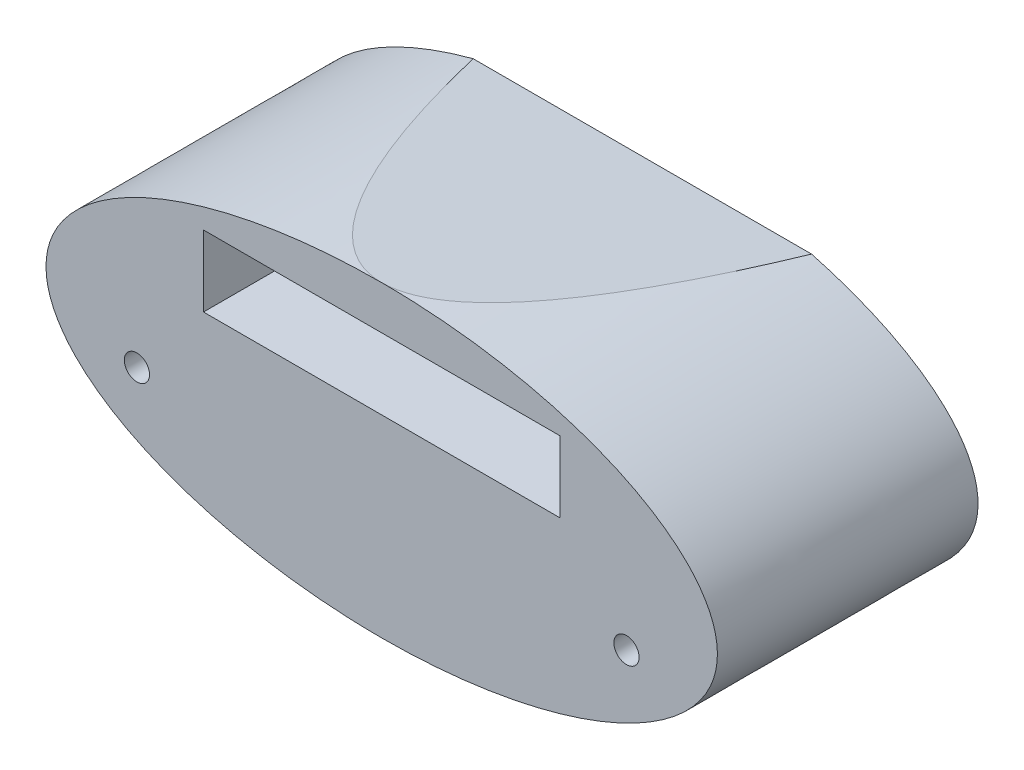
ISO-10303-21;
HEADER;
FILE_DESCRIPTION(('STEP AP214'),'2;1');
FILE_NAME('part.step','',(''),(''),'','','');
FILE_SCHEMA(('AUTOMOTIVE_DESIGN { 1 0 10303 214 1 1 1 1 }'));
ENDSEC;
DATA;
#1=APPLICATION_CONTEXT('core data for automotive mechanical design processes');
#2=APPLICATION_PROTOCOL_DEFINITION('international standard','automotive_design',2000,#1);
#3=PRODUCT_CONTEXT('',#1,'mechanical');
#4=PRODUCT('Part','Part','',(#3));
#5=PRODUCT_RELATED_PRODUCT_CATEGORY('part','',(#4));
#6=PRODUCT_DEFINITION_FORMATION('','',#4);
#7=PRODUCT_DEFINITION_CONTEXT('part definition',#1,'design');
#8=PRODUCT_DEFINITION('design','',#6,#7);
#9=PRODUCT_DEFINITION_SHAPE('','',#8);
#10=(LENGTH_UNIT() NAMED_UNIT(*) SI_UNIT(.MILLI.,.METRE.));
#11=(NAMED_UNIT(*) PLANE_ANGLE_UNIT() SI_UNIT($,.RADIAN.));
#12=(NAMED_UNIT(*) SI_UNIT($,.STERADIAN.) SOLID_ANGLE_UNIT());
#13=UNCERTAINTY_MEASURE_WITH_UNIT(LENGTH_MEASURE(1.E-05),#10,'distance_accuracy_value','');
#14=(GEOMETRIC_REPRESENTATION_CONTEXT(3) GLOBAL_UNCERTAINTY_ASSIGNED_CONTEXT((#13)) GLOBAL_UNIT_ASSIGNED_CONTEXT((#10,
#11,#12)) REPRESENTATION_CONTEXT('',''));
#15=CARTESIAN_POINT('',(0.,0.,0.));
#16=DIRECTION('',(0.,0.,1.));
#17=DIRECTION('',(1.,0.,0.));
#18=AXIS2_PLACEMENT_3D('',#15,#16,#17);
#19=CARTESIAN_POINT('',(0.,0.,-186.33));
#20=DIRECTION('',(0.,0.,1.));
#21=DIRECTION('',(1.,0.,0.));
#22=AXIS2_PLACEMENT_3D('',#19,#20,#21);
#23=ELLIPSE('',#22,240.,110.);
#24=DIRECTION('',(0.,0.,1.));
#25=VECTOR('',#24,1.);
#26=SURFACE_OF_LINEAR_EXTRUSION('',#23,#25);
#27=CARTESIAN_POINT('',(-120.987670979012,95.,-186.33));
#28=CARTESIAN_POINT('',(-120.23207515413,95.2021437868151,-183.818969880183));
#29=CARTESIAN_POINT('',(-119.467800227407,95.4040793580975,-181.310526213712));
#30=CARTESIAN_POINT('',(-117.920545508127,95.8076069391828,-176.297906601471));
#31=CARTESIAN_POINT('',(-117.137555910032,96.0091987068431,-173.793733663595));
#32=CARTESIAN_POINT('',(-115.552018117376,96.4119748130021,-168.790448872888));
#33=CARTESIAN_POINT('',(-114.749462273401,96.6131589577372,-166.291339426988));
#34=CARTESIAN_POINT('',(-113.12382840759,97.0150526338484,-161.299016182336));
#35=CARTESIAN_POINT('',(-112.300744933194,97.2157620232807,-158.805804146808));
#36=CARTESIAN_POINT('',(-110.632995855691,97.6166366296911,-153.826139785977));
#37=CARTESIAN_POINT('',(-109.788327012995,97.8168017599382,-151.339688538047));
#38=CARTESIAN_POINT('',(-108.07622777256,98.2165151360136,-146.374448980439));
#39=CARTESIAN_POINT('',(-107.208796306259,98.4160633523883,-143.895661036633));
#40=CARTESIAN_POINT('',(-105.438971289945,98.8169320469993,-138.916070112175));
#41=CARTESIAN_POINT('',(-104.5362784609,99.0182440236005,-136.415372738835));
#42=CARTESIAN_POINT('',(-102.704663686501,99.4200782390919,-131.423788114));
#43=CARTESIAN_POINT('',(-101.775744107907,99.6206005473944,-128.932900000266));
#44=CARTESIAN_POINT('',(-99.8899378324992,100.020767493863,-123.962026191238));
#45=CARTESIAN_POINT('',(-98.9330547865377,100.22041224272,-121.482039120934));
#46=CARTESIAN_POINT('',(-96.9893510806332,100.618728909412,-116.534149487287));
#47=CARTESIAN_POINT('',(-96.0025347485015,100.817400963102,-114.066245236347));
#48=CARTESIAN_POINT('',(-93.9967156847755,101.213668159061,-109.14381412815));
#49=CARTESIAN_POINT('',(-92.9777169812565,101.411263432501,-106.689285641469));
#50=CARTESIAN_POINT('',(-90.9049467457101,101.805263312899,-101.795019127169));
#51=CARTESIAN_POINT('',(-89.8511774049808,102.001667993969,-99.3552801789192));
#52=CARTESIAN_POINT('',(-87.9313307071577,102.352013766776,-95.0032849891087));
#53=CARTESIAN_POINT('',(-87.0723450262469,102.506205148965,-93.0879196395591));
#54=CARTESIAN_POINT('',(-85.329216083728,102.813675316,-89.2685252246522));
#55=CARTESIAN_POINT('',(-84.4450721798832,102.966954077427,-87.3644964501969));
#56=CARTESIAN_POINT('',(-82.6497985619518,103.27250611112,-83.568929087669));
#57=CARTESIAN_POINT('',(-81.7386667514168,103.424779304141,-81.6773914839549));
#58=CARTESIAN_POINT('',(-79.8873252339147,103.72821738086,-77.908083694963));
#59=CARTESIAN_POINT('',(-78.9471104799877,103.879382066495,-76.030315970004));
#60=CARTESIAN_POINT('',(-77.035197206218,104.180487966172,-72.2899784842124));
#61=CARTESIAN_POINT('',(-76.0634884499612,104.330428762186,-70.4274139161271));
#62=CARTESIAN_POINT('',(-74.0857958734082,104.628956755814,-66.7190991792787));
#63=CARTESIAN_POINT('',(-73.079793268394,104.777543153185,-64.8733589511376));
#64=CARTESIAN_POINT('',(-71.0304286281029,105.073187184612,-61.2008687927556));
#65=CARTESIAN_POINT('',(-69.9870407731897,105.220243667945,-59.3741331567875));
#66=CARTESIAN_POINT('',(-67.8601202383377,105.512511427296,-55.7435830501323));
#67=CARTESIAN_POINT('',(-66.7765808834383,105.657722391068,-53.939772458151));
#68=CARTESIAN_POINT('',(-64.5660996575565,105.945947419268,-50.3594411578551));
#69=CARTESIAN_POINT('',(-63.4391704792791,106.088962109296,-48.5829126783241));
#70=CARTESIAN_POINT('',(-61.1379844041021,106.37240868618,-45.0619393002773));
#71=CARTESIAN_POINT('',(-59.9637547320703,106.512841992889,-43.3174767643355));
#72=CARTESIAN_POINT('',(-57.5631876308679,106.790694159073,-39.865997155991));
#73=CARTESIAN_POINT('',(-56.336881586659,106.928114760573,-38.1589584441664));
#74=CARTESIAN_POINT('',(-53.8262152398939,107.199456021594,-34.7883572997635));
#75=CARTESIAN_POINT('',(-52.5418703778833,107.333377597201,-33.1247834875682));
#76=CARTESIAN_POINT('',(-50.2208898340151,107.565783405191,-30.2378385407148));
#77=CARTESIAN_POINT('',(-49.1977770791496,107.665137083503,-29.0036671487235));
#78=CARTESIAN_POINT('',(-47.1106234810752,107.861058998366,-26.5699251222983));
#79=CARTESIAN_POINT('',(-46.0465793323832,107.957627008849,-25.3703572960794));
#80=CARTESIAN_POINT('',(-43.8738885755468,108.147540626029,-23.0112503434659));
#81=CARTESIAN_POINT('',(-42.7652282164546,108.240885222526,-21.85172376578));
#82=CARTESIAN_POINT('',(-40.4987831357585,108.423856893245,-19.5788496721058));
#83=CARTESIAN_POINT('',(-39.3409489733754,108.513480037816,-18.4655509702522));
#84=CARTESIAN_POINT('',(-36.9848177056504,108.687382557387,-16.3053338721371));
#85=CARTESIAN_POINT('',(-35.7870158295828,108.771704977474,-15.2578807698241));
#86=CARTESIAN_POINT('',(-33.3370940247905,108.935112201706,-13.2280362304064));
#87=CARTESIAN_POINT('',(-32.0849794673733,109.014197521835,-12.2456383837652));
#88=CARTESIAN_POINT('',(-29.5250118999046,109.166049719702,-10.359330381863));
#89=CARTESIAN_POINT('',(-28.2172376270074,109.238825107888,-9.45531450981527));
#90=CARTESIAN_POINT('',(-25.5437204777565,109.376930867124,-7.73976476858755));
#91=CARTESIAN_POINT('',(-24.1780522568274,109.442270448674,-6.92811648657544));
#92=CARTESIAN_POINT('',(-22.0108568320171,109.536990917874,-5.75149881816307));
#93=CARTESIAN_POINT('',(-21.2297503869199,109.569399509518,-5.34891929276136));
#94=CARTESIAN_POINT('',(-19.6497640438578,109.631297711003,-4.58001983391748));
#95=CARTESIAN_POINT('',(-18.8508854728259,109.66078753788,-4.21369720445478));
#96=CARTESIAN_POINT('',(-17.2360388403484,109.716589788299,-3.52052164974473));
#97=CARTESIAN_POINT('',(-16.4200707622468,109.742902208745,-3.19366876296816));
#98=CARTESIAN_POINT('',(-14.7724710188983,109.792078496311,-2.58280091882563));
#99=CARTESIAN_POINT('',(-13.9408456973483,109.814943727655,-2.29876901506449));
#100=CARTESIAN_POINT('',(-12.2631457530866,109.856984362309,-1.77654025139376));
#101=CARTESIAN_POINT('',(-11.417070444502,109.876159589939,-1.53834557378153));
#102=CARTESIAN_POINT('',(-9.71256746552066,109.910582640112,-1.11074244452848));
#103=CARTESIAN_POINT('',(-8.85413988827817,109.925830492258,-0.921333625173694));
#104=CARTESIAN_POINT('',(-7.11996749360135,109.952308823092,-0.592419799555107));
#105=CARTESIAN_POINT('',(-6.24413707551156,109.963503347411,-0.453361418466375));
#106=CARTESIAN_POINT('',(-4.48545742220784,109.981525975067,-0.229484337721321));
#107=CARTESIAN_POINT('',(-3.60260784466205,109.9883538641,-0.144668300155245));
#108=CARTESIAN_POINT('',(-1.8333399845771,109.997537835578,-0.0305850064552187));
#109=CARTESIAN_POINT('',(-0.946921905263702,109.999894169166,-0.00131463062349606));
#110=CARTESIAN_POINT('',(0.826067188727071,110.00009885755,0.00122800848861349));
#111=CARTESIAN_POINT('',(1.71263820994497,109.997946859288,-0.0255041139283346));
#112=CARTESIAN_POINT('',(3.48235926415026,109.989167868137,-0.134556742007412));
#113=CARTESIAN_POINT('',(4.3655091053844,109.982540627964,-0.216880319435985));
#114=CARTESIAN_POINT('',(6.12492022544461,109.964912290048,-0.43585953302471));
#115=CARTESIAN_POINT('',(7.00118219696213,109.953911638016,-0.572509632564));
#116=CARTESIAN_POINT('',(8.4604780690361,109.931961043822,-0.845179913647779));
#117=CARTESIAN_POINT('',(9.04623450908781,109.922157114886,-0.966964318884287));
#118=CARTESIAN_POINT('',(10.2124557330301,109.900693930651,-1.23357999345282));
#119=CARTESIAN_POINT('',(10.7929202602948,109.889034585876,-1.37841237425326));
#120=CARTESIAN_POINT('',(12.5250339172112,109.851379345015,-1.84616577622188));
#121=CARTESIAN_POINT('',(13.6677748746613,109.822700581516,-2.20241337640952));
#122=CARTESIAN_POINT('',(15.924317138846,109.75881933087,-2.99594627193584));
#123=CARTESIAN_POINT('',(17.0381172878617,109.723616583201,-3.43323480348163));
#124=CARTESIAN_POINT('',(19.2341000766077,109.647341261599,-4.38072684842197));
#125=CARTESIAN_POINT('',(20.3162781595299,109.606267846665,-4.89094080872695));
#126=CARTESIAN_POINT('',(22.5894124438106,109.513078191617,-6.04854270373067));
#127=CARTESIAN_POINT('',(23.7756308538828,109.460219767456,-6.70515004866043));
#128=CARTESIAN_POINT('',(26.1052595183554,109.348659252842,-8.09095476119882));
#129=CARTESIAN_POINT('',(27.2486447243442,109.28995381432,-8.82019371851268));
#130=CARTESIAN_POINT('',(29.4928577772818,109.167503862285,-10.3412670226945));
#131=CARTESIAN_POINT('',(30.5936772914197,109.103758369475,-11.1331135343838));
#132=CARTESIAN_POINT('',(32.75740526825,108.971723443748,-12.7732513817674));
#133=CARTESIAN_POINT('',(33.8201849586656,108.903420475193,-13.6217108571519));
#134=CARTESIAN_POINT('',(35.9059198711634,108.763065562515,-15.3651995824443));
#135=CARTESIAN_POINT('',(36.9288866352853,108.691014719293,-16.2602151569386));
#136=CARTESIAN_POINT('',(38.937500694426,108.543654395584,-18.0907250980537));
#137=CARTESIAN_POINT('',(39.9231493424828,108.468345033452,-19.0262179944532));
#138=CARTESIAN_POINT('',(42.1056063765331,108.295386613042,-21.1747074927902));
#139=CARTESIAN_POINT('',(43.2924065728746,108.196924826053,-22.3977998107718));
#140=CARTESIAN_POINT('',(45.6158552748987,107.996202883309,-24.8911677835328));
#141=CARTESIAN_POINT('',(46.7524829968309,107.893941185171,-26.1614625978012));
#142=CARTESIAN_POINT('',(48.9801886672175,107.686130320858,-28.742889154297));
#143=CARTESIAN_POINT('',(50.0712276494129,107.580578471771,-30.0540542236587));
#144=CARTESIAN_POINT('',(52.2114117490476,107.366643987203,-32.7115483909593));
#145=CARTESIAN_POINT('',(53.2605230287372,107.258259177571,-34.0579044962151));
#146=CARTESIAN_POINT('',(55.319830533146,107.039070958872,-36.7806605488878));
#147=CARTESIAN_POINT('',(56.3300108785405,106.928266591179,-38.1570724043739));
#148=CARTESIAN_POINT('',(58.3139048476148,106.704618328628,-40.9352311217803));
#149=CARTESIAN_POINT('',(59.2876269633721,106.591774917911,-42.3369719697088));
#150=CARTESIAN_POINT('',(61.2109961044281,106.363170734478,-45.1766931363171));
#151=CARTESIAN_POINT('',(62.1603154704184,106.247392238629,-46.6148936117452));
#152=CARTESIAN_POINT('',(64.0267490083327,106.014303371552,-49.5103235185812));
#153=CARTESIAN_POINT('',(64.9438872935206,105.896994241735,-50.9675375291737));
#154=CARTESIAN_POINT('',(66.7486141924224,105.660996607001,-53.8991001478354));
#155=CARTESIAN_POINT('',(67.6362160418789,105.542308752978,-55.3734406705103));
#156=CARTESIAN_POINT('',(69.3841454776825,105.303688412904,-58.3375825349017));
#157=CARTESIAN_POINT('',(70.2444798565786,105.183756246862,-59.8273799014803));
#158=CARTESIAN_POINT('',(71.9398419266955,104.942767540186,-62.8209416158054));
#159=CARTESIAN_POINT('',(72.7748729157051,104.821711148783,-64.3247041098124));
#160=CARTESIAN_POINT('',(74.4213424432654,104.578582415729,-67.3448492318143));
#161=CARTESIAN_POINT('',(75.2327827441394,104.456510150848,-68.8612309061614));
#162=CARTESIAN_POINT('',(76.8573787047134,104.207804405422,-71.9506536758418));
#163=CARTESIAN_POINT('',(77.6698710826338,104.081143046728,-73.524041073548));
#164=CARTESIAN_POINT('',(79.2729816172689,103.826930670814,-76.6818672071474));
#165=CARTESIAN_POINT('',(80.0635994631944,103.699379640987,-78.2663060996582));
#166=CARTESIAN_POINT('',(81.6244136320765,103.443449492505,-81.4454704041057));
#167=CARTESIAN_POINT('',(82.3946065080392,103.315070238563,-83.0401974965649));
#168=CARTESIAN_POINT('',(83.9156385454017,103.057575069112,-86.2388024914954));
#169=CARTESIAN_POINT('',(84.6664775069777,102.928459146012,-87.8426804882385));
#170=CARTESIAN_POINT('',(86.892304009632,102.539985665953,-92.668298057532));
#171=CARTESIAN_POINT('',(88.3399140724042,102.279615506425,-95.9026161791879));
#172=CARTESIAN_POINT('',(91.170527448174,101.756465893611,-102.401180669567));
#173=CARTESIAN_POINT('',(92.5534956598439,101.493685221936,-105.665442173105));
#174=CARTESIAN_POINT('',(95.2610611296437,100.966053416486,-112.219684460415));
#175=CARTESIAN_POINT('',(96.5856307594329,100.701201371049,-115.509676568833));
#176=CARTESIAN_POINT('',(99.1815522774427,100.169733972716,-122.111564590923));
#177=CARTESIAN_POINT('',(100.452887998562,99.9031181122126,-125.423466810095));
#178=CARTESIAN_POINT('',(102.888078089103,99.3809613888809,-131.909697627322));
#179=CARTESIAN_POINT('',(104.05417667876,99.1254878106104,-135.083190416598));
#180=CARTESIAN_POINT('',(106.345130684406,98.6134144047015,-141.444166264798));
#181=CARTESIAN_POINT('',(107.469994698447,98.3568148244911,-144.631646250171));
#182=CARTESIAN_POINT('',(109.681150302081,97.8427142804228,-151.017803208589));
#183=CARTESIAN_POINT('',(110.767463733167,97.5852139207983,-154.216472675843));
#184=CARTESIAN_POINT('',(112.903826469307,97.0695268440081,-160.622337543732));
#185=CARTESIAN_POINT('',(113.953910202821,96.8113410444362,-163.829521546013));
#186=CARTESIAN_POINT('',(116.019843913726,96.2944911696392,-170.249830690742));
#187=CARTESIAN_POINT('',(117.03574004383,96.0358282809553,-173.462941093974));
#188=CARTESIAN_POINT('',(119.035025659736,95.5182229878807,-179.892634044546));
#189=CARTESIAN_POINT('',(120.018472207693,95.2592820032087,-183.109198956141));
#190=CARTESIAN_POINT('',(120.987670979012,95.,-186.33));
#191=B_SPLINE_CURVE_WITH_KNOTS('',3,(#27,#28,#29,#30,#31,#32,#33,#34,#35,#36,#37,#38,#39,#40,
#41,#42,#43,#44,#45,#46,#47,#48,#49,#50,#51,#52,#53,#54,#55,#56,#57,#58,#59,#60,#61,#62,#63,#64,
#65,#66,#67,#68,#69,#70,#71,#72,#73,#74,#75,#76,#77,#78,#79,#80,#81,#82,#83,#84,#85,#86,#87,#88,
#89,#90,#91,#92,#93,#94,#95,#96,#97,#98,#99,#100,#101,#102,#103,#104,#105,#106,#107,#108,#109,
#110,#111,#112,#113,#114,#115,#116,#117,#118,#119,#120,#121,#122,#123,#124,#125,#126,#127,#128,
#129,#130,#131,#132,#133,#134,#135,#136,#137,#138,#139,#140,#141,#142,#143,#144,#145,#146,#147,
#148,#149,#150,#151,#152,#153,#154,#155,#156,#157,#158,#159,#160,#161,#162,#163,#164,#165,#166,
#167,#168,#169,#170,#171,#172,#173,#174,#175,#176,#177,#178,#179,#180,#181,#182,#183,#184,#185,
#186,#187,#188,#189,#190),.UNSPECIFIED.,.F.,.F.,(4,2,2,2,2,2,2,2,2,2,2,2,2,2,2,2,2,2,2,2,2,2,2,
2,2,2,2,2,2,2,2,2,2,2,2,2,2,2,2,2,2,2,2,2,2,2,2,2,2,2,2,2,2,2,2,2,2,2,2,2,2,2,2,2,2,2,2,2,2,2,2,
2,2,2,2,2,2,2,2,2,2,4),(0.,7.89008719329245,15.7844031665799,23.6818565429294,31.5814304692685,
39.4821970295058,47.3833351471496,55.3819357597471,63.3798168538817,71.3766583858873,
79.3723491791921,87.3670431351028,95.3612342119934,101.675524114957,107.989975353375,
114.304918397975,120.620963534311,126.939082562001,133.260719826243,139.586810546231,
145.913957703303,152.239267853865,158.560987941605,164.878950724781,171.19524247121,
176.013006428875,180.831160273287,185.650810644476,190.475427196521,195.253721348322,
200.031544018496,204.802819022191,209.568118146523,212.205369290092,214.842424183179,
217.479481646558,220.115492739912,222.751629301977,225.387745994091,228.04670401279,
230.705792517059,233.364731670365,236.023879059709,238.683173395164,241.342196781346,
243.136831578868,244.93155294732,248.519863656718,252.108317688999,255.697286300374,
259.764840322276,263.834737011738,267.90542644601,271.988795882557,276.070972567775,
280.153001104027,285.272606750417,290.394313643776,295.520312242451,300.650367510845,
305.782493568316,310.913416686713,316.094409515171,321.271433517101,326.446105486389,
331.619478105982,336.792173554772,341.964481583323,347.29023621308,352.616066471343,
357.942789889265,363.269568282079,373.927828287487,384.591810176773,395.260784209248,
405.93297524277,416.104448306132,426.273788252585,436.437271483508,446.590814474545,
456.73005045433,466.850387076278),.UNSPECIFIED.);
#192=CARTESIAN_POINT('',(-120.987670979012,95.,-186.33));
#193=VERTEX_POINT('',#192);
#194=CARTESIAN_POINT('',(0.,110.,0.));
#195=VERTEX_POINT('',#194);
#196=EDGE_CURVE('E151',#193,#195,#191,.T.);
#197=ORIENTED_EDGE('',*,*,#196,.F.);
#198=CARTESIAN_POINT('',(-120.987670979012,-95.,-186.33));
#199=VERTEX_POINT('',#198);
#200=EDGE_CURVE('E11',#193,#199,#23,.T.);
#201=ORIENTED_EDGE('',*,*,#200,.T.);
#202=CARTESIAN_POINT('',(120.987670979012,-95.,-186.33));
#203=CARTESIAN_POINT('',(120.23207515413,-95.2021437868151,-183.818969880183));
#204=CARTESIAN_POINT('',(119.467800227407,-95.4040793580975,-181.310526213712));
#205=CARTESIAN_POINT('',(117.920545508127,-95.8076069391828,-176.297906601471));
#206=CARTESIAN_POINT('',(117.137555910032,-96.0091987068431,-173.793733663595));
#207=CARTESIAN_POINT('',(115.552018117376,-96.4119748130021,-168.790448872888));
#208=CARTESIAN_POINT('',(114.749462273401,-96.6131589577372,-166.291339426988));
#209=CARTESIAN_POINT('',(113.12382840759,-97.0150526338484,-161.299016182336));
#210=CARTESIAN_POINT('',(112.300744933194,-97.2157620232807,-158.805804146808));
#211=CARTESIAN_POINT('',(110.632995855691,-97.6166366296911,-153.826139785977));
#212=CARTESIAN_POINT('',(109.788327012995,-97.8168017599382,-151.339688538047));
#213=CARTESIAN_POINT('',(108.07622777256,-98.2165151360136,-146.374448980439));
#214=CARTESIAN_POINT('',(107.208796306259,-98.4160633523883,-143.895661036633));
#215=CARTESIAN_POINT('',(105.438971289945,-98.8169320469993,-138.916070112175));
#216=CARTESIAN_POINT('',(104.5362784609,-99.0182440236005,-136.415372738835));
#217=CARTESIAN_POINT('',(102.704663686501,-99.4200782390919,-131.423788114));
#218=CARTESIAN_POINT('',(101.775744107907,-99.6206005473944,-128.932900000266));
#219=CARTESIAN_POINT('',(99.8899378324992,-100.020767493863,-123.962026191238));
#220=CARTESIAN_POINT('',(98.9330547865377,-100.22041224272,-121.482039120934));
#221=CARTESIAN_POINT('',(96.9893510806332,-100.618728909412,-116.534149487287));
#222=CARTESIAN_POINT('',(96.0025347485015,-100.817400963102,-114.066245236347));
#223=CARTESIAN_POINT('',(93.9967156847754,-101.213668159061,-109.14381412815));
#224=CARTESIAN_POINT('',(92.9777169812565,-101.411263432501,-106.689285641469));
#225=CARTESIAN_POINT('',(90.90494674571,-101.805263312899,-101.795019127169));
#226=CARTESIAN_POINT('',(89.8511774049806,-102.001667993969,-99.3552801789191));
#227=CARTESIAN_POINT('',(87.9313307071576,-102.352013766776,-95.0032849891085));
#228=CARTESIAN_POINT('',(87.0723450262469,-102.506205148965,-93.0879196395589));
#229=CARTESIAN_POINT('',(85.3292160837279,-102.813675316,-89.268525224652));
#230=CARTESIAN_POINT('',(84.4450721798831,-102.966954077427,-87.3644964501968));
#231=CARTESIAN_POINT('',(82.6497985619518,-103.27250611112,-83.5689290876689));
#232=CARTESIAN_POINT('',(81.7386667514169,-103.424779304141,-81.6773914839547));
#233=CARTESIAN_POINT('',(79.8873252339147,-103.72821738086,-77.9080836949628));
#234=CARTESIAN_POINT('',(78.9471104799876,-103.879382066495,-76.0303159700039));
#235=CARTESIAN_POINT('',(77.035197206218,-104.180487966172,-72.2899784842124));
#236=CARTESIAN_POINT('',(76.0634884499612,-104.330428762186,-70.427413916127));
#237=CARTESIAN_POINT('',(74.0857958734082,-104.628956755814,-66.7190991792787));
#238=CARTESIAN_POINT('',(73.079793268394,-104.777543153185,-64.8733589511375));
#239=CARTESIAN_POINT('',(71.0304286281029,-105.073187184612,-61.2008687927555));
#240=CARTESIAN_POINT('',(69.9870407731897,-105.220243667945,-59.3741331567874));
#241=CARTESIAN_POINT('',(67.8601202383377,-105.512511427296,-55.7435830501323));
#242=CARTESIAN_POINT('',(66.7765808834384,-105.657722391068,-53.939772458151));
#243=CARTESIAN_POINT('',(64.5660996575566,-105.945947419268,-50.359441157855));
#244=CARTESIAN_POINT('',(63.439170479279,-106.088962109296,-48.5829126783241));
#245=CARTESIAN_POINT('',(61.1379844041021,-106.37240868618,-45.0619393002773));
#246=CARTESIAN_POINT('',(59.9637547320703,-106.512841992889,-43.3174767643355));
#247=CARTESIAN_POINT('',(57.563187630868,-106.790694159073,-39.865997155991));
#248=CARTESIAN_POINT('',(56.336881586659,-106.928114760573,-38.1589584441665));
#249=CARTESIAN_POINT('',(53.8262152398939,-107.199456021594,-34.7883572997636));
#250=CARTESIAN_POINT('',(52.5418703778833,-107.333377597201,-33.1247834875684));
#251=CARTESIAN_POINT('',(50.2208898340151,-107.565783405191,-30.2378385407149));
#252=CARTESIAN_POINT('',(49.1977770791497,-107.665137083503,-29.0036671487236));
#253=CARTESIAN_POINT('',(47.1106234810754,-107.861058998366,-26.5699251222983));
#254=CARTESIAN_POINT('',(46.0465793323833,-107.957627008849,-25.3703572960795));
#255=CARTESIAN_POINT('',(43.8738885755469,-108.147540626029,-23.011250343466));
#256=CARTESIAN_POINT('',(42.7652282164548,-108.240885222526,-21.8517237657801));
#257=CARTESIAN_POINT('',(40.4987831357587,-108.423856893245,-19.5788496721059));
#258=CARTESIAN_POINT('',(39.3409489733756,-108.513480037816,-18.4655509702523));
#259=CARTESIAN_POINT('',(36.9848177056505,-108.687382557387,-16.3053338721372));
#260=CARTESIAN_POINT('',(35.7870158295831,-108.771704977473,-15.2578807698242));
#261=CARTESIAN_POINT('',(33.3370940247907,-108.935112201706,-13.2280362304064));
#262=CARTESIAN_POINT('',(32.0849794673734,-109.014197521835,-12.2456383837653));
#263=CARTESIAN_POINT('',(29.5250118999046,-109.166049719702,-10.3593303818632));
#264=CARTESIAN_POINT('',(28.2172376270076,-109.238825107888,-9.45531450981542));
#265=CARTESIAN_POINT('',(25.5437204777568,-109.376930867124,-7.73976476858759));
#266=CARTESIAN_POINT('',(24.1780522568277,-109.442270448674,-6.92811648657543));
#267=CARTESIAN_POINT('',(22.0108568320173,-109.536990917874,-5.75149881816321));
#268=CARTESIAN_POINT('',(21.2297503869201,-109.569399509518,-5.34891929276159));
#269=CARTESIAN_POINT('',(19.649764043858,-109.631297711003,-4.58001983391768));
#270=CARTESIAN_POINT('',(18.8508854728262,-109.66078753788,-4.21369720445486));
#271=CARTESIAN_POINT('',(17.2360388403487,-109.716589788299,-3.52052164974475));
#272=CARTESIAN_POINT('',(16.420070762247,-109.742902208745,-3.19366876296825));
#273=CARTESIAN_POINT('',(14.7724710188985,-109.792078496311,-2.58280091882574));
#274=CARTESIAN_POINT('',(13.9408456973485,-109.814943727655,-2.29876901506456));
#275=CARTESIAN_POINT('',(12.2631457530869,-109.856984362309,-1.77654025139385));
#276=CARTESIAN_POINT('',(11.4170704445023,-109.876159589939,-1.53834557378168));
#277=CARTESIAN_POINT('',(9.71256746552095,-109.910582640112,-1.11074244452857));
#278=CARTESIAN_POINT('',(8.8541398882785,-109.925830492258,-0.921333625173674));
#279=CARTESIAN_POINT('',(7.1199674936017,-109.952308823092,-0.592419799555014));
#280=CARTESIAN_POINT('',(6.2441370755119,-109.963503347411,-0.453361418466327));
#281=CARTESIAN_POINT('',(4.48545742220816,-109.981525975067,-0.229484337721321));
#282=CARTESIAN_POINT('',(3.60260784466236,-109.9883538641,-0.144668300155247));
#283=CARTESIAN_POINT('',(1.8333399845774,-109.997537835578,-0.0305850064552765));
#284=CARTESIAN_POINT('',(0.946921905264,-109.999894169166,-0.00131463062360703));
#285=CARTESIAN_POINT('',(-0.826067188726794,-110.00009885755,0.00122800848858624));
#286=CARTESIAN_POINT('',(-1.71263820994471,-109.997946859288,-0.0255041139282251));
#287=CARTESIAN_POINT('',(-3.48235926415001,-109.989167868137,-0.134556742007261));
#288=CARTESIAN_POINT('',(-4.36550910538414,-109.982540627964,-0.216880319435929));
#289=CARTESIAN_POINT('',(-6.12492022544436,-109.964912290048,-0.435859533024683));
#290=CARTESIAN_POINT('',(-7.00118219696189,-109.953911638016,-0.572509632563907));
#291=CARTESIAN_POINT('',(-8.46047806903585,-109.931961043822,-0.845179913647701));
#292=CARTESIAN_POINT('',(-9.04623450908755,-109.922157114886,-0.966964318884248));
#293=CARTESIAN_POINT('',(-10.2124557330299,-109.900693930651,-1.23357999345269));
#294=CARTESIAN_POINT('',(-10.7929202602946,-109.889034585876,-1.37841237425299));
#295=CARTESIAN_POINT('',(-12.525033917211,-109.851379345015,-1.84616577622147));
#296=CARTESIAN_POINT('',(-13.667774874661,-109.822700581516,-2.20241337640935));
#297=CARTESIAN_POINT('',(-15.9243171388457,-109.75881933087,-2.99594627193579));
#298=CARTESIAN_POINT('',(-17.0381172878614,-109.723616583201,-3.43323480348146));
#299=CARTESIAN_POINT('',(-19.2341000766074,-109.647341261599,-4.38072684842177));
#300=CARTESIAN_POINT('',(-20.3162781595295,-109.606267846665,-4.89094080872684));
#301=CARTESIAN_POINT('',(-22.5894124438102,-109.513078191617,-6.04854270373061));
#302=CARTESIAN_POINT('',(-23.7756308538825,-109.460219767456,-6.70515004866031));
#303=CARTESIAN_POINT('',(-26.105259518355,-109.348659252842,-8.09095476119853));
#304=CARTESIAN_POINT('',(-27.248644724344,-109.28995381432,-8.82019371851229));
#305=CARTESIAN_POINT('',(-29.4928577772816,-109.167503862285,-10.341267022694));
#306=CARTESIAN_POINT('',(-30.5936772914195,-109.103758369475,-11.1331135343834));
#307=CARTESIAN_POINT('',(-32.7574052682496,-108.971723443748,-12.773251381767));
#308=CARTESIAN_POINT('',(-33.8201849586652,-108.903420475193,-13.6217108571515));
#309=CARTESIAN_POINT('',(-35.905919871163,-108.763065562515,-15.3651995824439));
#310=CARTESIAN_POINT('',(-36.9288866352849,-108.691014719293,-16.2602151569383));
#311=CARTESIAN_POINT('',(-38.9375006944256,-108.543654395584,-18.0907250980533));
#312=CARTESIAN_POINT('',(-39.9231493424825,-108.468345033453,-19.0262179944526));
#313=CARTESIAN_POINT('',(-42.1056063765328,-108.295386613042,-21.1747074927896));
#314=CARTESIAN_POINT('',(-43.2924065728741,-108.196924826053,-22.3977998107713));
#315=CARTESIAN_POINT('',(-45.6158552748981,-107.996202883309,-24.8911677835324));
#316=CARTESIAN_POINT('',(-46.7524829968304,-107.893941185171,-26.1614625978006));
#317=CARTESIAN_POINT('',(-48.9801886672171,-107.686130320858,-28.7428891542963));
#318=CARTESIAN_POINT('',(-50.0712276494124,-107.580578471771,-30.0540542236581));
#319=CARTESIAN_POINT('',(-52.2114117490471,-107.366643987203,-32.7115483909586));
#320=CARTESIAN_POINT('',(-53.2605230287367,-107.258259177571,-34.0579044962143));
#321=CARTESIAN_POINT('',(-55.3198305331455,-107.039070958872,-36.780660548887));
#322=CARTESIAN_POINT('',(-56.3300108785399,-106.928266591179,-38.1570724043731));
#323=CARTESIAN_POINT('',(-58.3139048476141,-106.704618328628,-40.9352311217795));
#324=CARTESIAN_POINT('',(-59.2876269633715,-106.591774917911,-42.3369719697079));
#325=CARTESIAN_POINT('',(-61.2109961044276,-106.363170734478,-45.1766931363162));
#326=CARTESIAN_POINT('',(-62.1603154704178,-106.24739223863,-46.6148936117443));
#327=CARTESIAN_POINT('',(-64.026749008332,-106.014303371552,-49.5103235185803));
#328=CARTESIAN_POINT('',(-64.9438872935201,-105.896994241735,-50.9675375291727));
#329=CARTESIAN_POINT('',(-66.7486141924219,-105.660996607001,-53.8991001478344));
#330=CARTESIAN_POINT('',(-67.6362160418784,-105.542308752978,-55.3734406705093));
#331=CARTESIAN_POINT('',(-69.384145477682,-105.303688412904,-58.3375825349007));
#332=CARTESIAN_POINT('',(-70.244479856578,-105.183756246862,-59.8273799014792));
#333=CARTESIAN_POINT('',(-71.9398419266949,-104.942767540186,-62.8209416158043));
#334=CARTESIAN_POINT('',(-72.7748729157046,-104.821711148784,-64.3247041098113));
#335=CARTESIAN_POINT('',(-74.4213424432648,-104.578582415729,-67.3448492318131));
#336=CARTESIAN_POINT('',(-75.2327827441388,-104.456510150848,-68.8612309061602));
#337=CARTESIAN_POINT('',(-76.8573787047127,-104.207804405423,-71.9506536758407));
#338=CARTESIAN_POINT('',(-77.6698710826332,-104.081143046728,-73.5240410735469));
#339=CARTESIAN_POINT('',(-79.2729816172684,-103.826930670814,-76.6818672071464));
#340=CARTESIAN_POINT('',(-80.063599463194,-103.699379640987,-78.2663060996571));
#341=CARTESIAN_POINT('',(-81.6244136320761,-103.443449492505,-81.4454704041047));
#342=CARTESIAN_POINT('',(-82.3946065080388,-103.315070238564,-83.0401974965639));
#343=CARTESIAN_POINT('',(-83.9156385454012,-103.057575069112,-86.2388024914945));
#344=CARTESIAN_POINT('',(-84.6664775069773,-102.928459146012,-87.8426804882376));
#345=CARTESIAN_POINT('',(-86.8923040096316,-102.539985665953,-92.6682980575312));
#346=CARTESIAN_POINT('',(-88.3399140724038,-102.279615506425,-95.9026161791872));
#347=CARTESIAN_POINT('',(-91.1705274481736,-101.756465893611,-102.401180669566));
#348=CARTESIAN_POINT('',(-92.5534956598436,-101.493685221936,-105.665442173105));
#349=CARTESIAN_POINT('',(-95.2610611296435,-100.966053416486,-112.219684460415));
#350=CARTESIAN_POINT('',(-96.5856307594328,-100.701201371049,-115.509676568833));
#351=CARTESIAN_POINT('',(-99.1815522774427,-100.169733972716,-122.111564590922));
#352=CARTESIAN_POINT('',(-100.452887998562,-99.9031181122127,-125.423466810095));
#353=CARTESIAN_POINT('',(-102.888078089103,-99.3809613888809,-131.909697627322));
#354=CARTESIAN_POINT('',(-104.05417667876,-99.1254878106104,-135.083190416598));
#355=CARTESIAN_POINT('',(-106.345130684405,-98.6134144047015,-141.444166264798));
#356=CARTESIAN_POINT('',(-107.469994698446,-98.3568148244911,-144.631646250171));
#357=CARTESIAN_POINT('',(-109.681150302081,-97.8427142804228,-151.017803208588));
#358=CARTESIAN_POINT('',(-110.767463733167,-97.5852139207983,-154.216472675843));
#359=CARTESIAN_POINT('',(-112.903826469307,-97.0695268440081,-160.622337543732));
#360=CARTESIAN_POINT('',(-113.953910202821,-96.8113410444363,-163.829521546013));
#361=CARTESIAN_POINT('',(-116.019843913726,-96.2944911696392,-170.249830690742));
#362=CARTESIAN_POINT('',(-117.03574004383,-96.0358282809553,-173.462941093974));
#363=CARTESIAN_POINT('',(-119.035025659736,-95.5182229878807,-179.892634044546));
#364=CARTESIAN_POINT('',(-120.018472207693,-95.2592820032087,-183.109198956141));
#365=CARTESIAN_POINT('',(-120.987670979012,-95.,-186.33));
#366=B_SPLINE_CURVE_WITH_KNOTS('',3,(#202,#203,#204,#205,#206,#207,#208,#209,#210,#211,#212,
#213,#214,#215,#216,#217,#218,#219,#220,#221,#222,#223,#224,#225,#226,#227,#228,#229,#230,#231,
#232,#233,#234,#235,#236,#237,#238,#239,#240,#241,#242,#243,#244,#245,#246,#247,#248,#249,#250,
#251,#252,#253,#254,#255,#256,#257,#258,#259,#260,#261,#262,#263,#264,#265,#266,#267,#268,#269,
#270,#271,#272,#273,#274,#275,#276,#277,#278,#279,#280,#281,#282,#283,#284,#285,#286,#287,#288,
#289,#290,#291,#292,#293,#294,#295,#296,#297,#298,#299,#300,#301,#302,#303,#304,#305,#306,#307,
#308,#309,#310,#311,#312,#313,#314,#315,#316,#317,#318,#319,#320,#321,#322,#323,#324,#325,#326,
#327,#328,#329,#330,#331,#332,#333,#334,#335,#336,#337,#338,#339,#340,#341,#342,#343,#344,#345,
#346,#347,#348,#349,#350,#351,#352,#353,#354,#355,#356,#357,#358,#359,#360,#361,#362,#363,#364,
#365),.UNSPECIFIED.,.F.,.F.,(4,2,2,2,2,2,2,2,2,2,2,2,2,2,2,2,2,2,2,2,2,2,2,2,2,2,2,2,2,2,2,2,2,
2,2,2,2,2,2,2,2,2,2,2,2,2,2,2,2,2,2,2,2,2,2,2,2,2,2,2,2,2,2,2,2,2,2,2,2,2,2,2,2,2,2,2,2,2,2,2,2,
4),(0.,7.89008719329243,15.7844031665799,23.6818565429295,31.5814304692685,39.4821970295059,
47.3833351471497,55.3819357597472,63.3798168538818,71.3766583858875,79.3723491791923,
87.367043135103,95.3612342119936,101.675524114957,107.989975353375,114.304918397976,
120.620963534311,126.939082562002,133.260719826244,139.586810546231,145.913957703303,
152.239267853865,158.560987941605,164.878950724781,171.19524247121,176.013006428875,
180.831160273286,185.650810644476,190.475427196521,195.253721348322,200.031544018496,
204.802819022191,209.568118146522,212.205369290092,214.842424183179,217.479481646557,
220.115492739912,222.751629301976,225.38774599409,228.046704012789,230.705792517058,
233.364731670365,236.023879059709,238.683173395164,241.342196781346,243.136831578867,
244.931552947319,248.519863656718,252.108317688998,255.697286300373,259.764840322276,
263.834737011737,267.90542644601,271.988795882556,276.070972567774,280.153001104027,
285.272606750416,290.394313643775,295.52031224245,300.650367510844,305.782493568315,
310.913416686712,316.094409515169,321.271433517099,326.446105486387,331.619478105981,
336.792173554771,341.964481583322,347.290236213078,352.616066471342,357.942789889264,
363.269568282078,373.927828287486,384.591810176772,395.260784209248,405.932975242769,
416.104448306132,426.273788252585,436.437271483508,446.590814474544,456.73005045433,
466.850387076278),.UNSPECIFIED.);
#367=CARTESIAN_POINT('',(0.,-110.,0.));
#368=VERTEX_POINT('',#367);
#369=EDGE_CURVE('E52',#368,#199,#366,.T.);
#370=ORIENTED_EDGE('',*,*,#369,.F.);
#371=CARTESIAN_POINT('',(0.,0.,0.));
#372=DIRECTION('',(0.,0.,1.));
#373=DIRECTION('',(1.,0.,0.));
#374=AXIS2_PLACEMENT_3D('',#371,#372,#373);
#375=ELLIPSE('',#374,240.,110.);
#376=EDGE_CURVE('E41',#195,#368,#375,.T.);
#377=ORIENTED_EDGE('',*,*,#376,.F.);
#378=EDGE_LOOP('',(#197,#201,#370,#377));
#379=FACE_BOUND('',#378,.T.);
#380=ADVANCED_FACE('F35',(#379),#26,.T.);
#381=CARTESIAN_POINT('',(120.987670979012,95.,-186.33));
#382=VERTEX_POINT('',#381);
#383=EDGE_CURVE('E60',#195,#382,#191,.T.);
#384=ORIENTED_EDGE('',*,*,#383,.F.);
#385=EDGE_CURVE('E109',#368,#195,#375,.T.);
#386=ORIENTED_EDGE('',*,*,#385,.F.);
#387=CARTESIAN_POINT('',(120.987670979012,-95.,-186.33));
#388=VERTEX_POINT('',#387);
#389=EDGE_CURVE('E94',#388,#368,#366,.T.);
#390=ORIENTED_EDGE('',*,*,#389,.F.);
#391=EDGE_CURVE('E45',#388,#382,#23,.T.);
#392=ORIENTED_EDGE('',*,*,#391,.T.);
#393=EDGE_LOOP('',(#384,#386,#390,#392));
#394=FACE_BOUND('',#393,.T.);
#395=ADVANCED_FACE('F37',(#394),#26,.T.);
#396=CARTESIAN_POINT('',(0.,0.,-186.33));
#397=DIRECTION('',(0.,0.,1.));
#398=DIRECTION('',(1.,0.,0.));
#399=AXIS2_PLACEMENT_3D('',#396,#397,#398);
#400=PLANE('',#399);
#401=CARTESIAN_POINT('',(175.,-30.,-186.33));
#402=DIRECTION('',(0.,0.,1.));
#403=DIRECTION('',(1.,0.,0.));
#404=AXIS2_PLACEMENT_3D('',#401,#402,#403);
#405=CIRCLE('',#404,9.00000000000001);
#406=CARTESIAN_POINT('',(184.,-30.,-186.33));
#407=VERTEX_POINT('',#406);
#408=EDGE_CURVE('E136',#407,#407,#405,.T.);
#409=ORIENTED_EDGE('',*,*,#408,.T.);
#410=EDGE_LOOP('',(#409));
#411=FACE_BOUND('',#410,.T.);
#412=CARTESIAN_POINT('',(-175.,-30.,-186.33));
#413=DIRECTION('',(0.,0.,1.));
#414=DIRECTION('',(-1.,0.,0.));
#415=AXIS2_PLACEMENT_3D('',#412,#413,#414);
#416=CIRCLE('',#415,9.00000000000001);
#417=CARTESIAN_POINT('',(-184.,-30.,-186.33));
#418=VERTEX_POINT('',#417);
#419=EDGE_CURVE('E150',#418,#418,#416,.T.);
#420=ORIENTED_EDGE('',*,*,#419,.T.);
#421=EDGE_LOOP('',(#420));
#422=FACE_BOUND('',#421,.T.);
#423=DIRECTION('',(-1.,0.,0.));
#424=VECTOR('',#423,1.);
#425=CARTESIAN_POINT('',(-127.4,78.9000000000001,-186.33));
#426=LINE('',#425,#424);
#427=CARTESIAN_POINT('',(127.4,78.9,-186.33));
#428=VERTEX_POINT('',#427);
#429=CARTESIAN_POINT('',(-127.4,78.9000000000001,-186.33));
#430=VERTEX_POINT('',#429);
#431=EDGE_CURVE('E119',#428,#430,#426,.T.);
#432=ORIENTED_EDGE('',*,*,#431,.T.);
#433=DIRECTION('',(0.,-1.,0.));
#434=VECTOR('',#433,1.);
#435=CARTESIAN_POINT('',(-127.4,78.9000000000001,-186.33));
#436=LINE('',#435,#434);
#437=CARTESIAN_POINT('',(-127.4,28.1,-186.33));
#438=VERTEX_POINT('',#437);
#439=EDGE_CURVE('E127',#430,#438,#436,.T.);
#440=ORIENTED_EDGE('',*,*,#439,.T.);
#441=DIRECTION('',(1.,0.,0.));
#442=VECTOR('',#441,1.);
#443=CARTESIAN_POINT('',(-127.4,28.1,-186.33));
#444=LINE('',#443,#442);
#445=CARTESIAN_POINT('',(127.4,28.1,-186.33));
#446=VERTEX_POINT('',#445);
#447=EDGE_CURVE('E142',#438,#446,#444,.T.);
#448=ORIENTED_EDGE('',*,*,#447,.T.);
#449=DIRECTION('',(0.,1.,0.));
#450=VECTOR('',#449,1.);
#451=CARTESIAN_POINT('',(127.4,78.9,-186.33));
#452=LINE('',#451,#450);
#453=EDGE_CURVE('E139',#446,#428,#452,.T.);
#454=ORIENTED_EDGE('',*,*,#453,.T.);
#455=EDGE_LOOP('',(#432,#440,#448,#454));
#456=FACE_BOUND('',#455,.T.);
#457=ORIENTED_EDGE('',*,*,#200,.F.);
#458=DIRECTION('',(1.,0.,0.));
#459=VECTOR('',#458,1.);
#460=CARTESIAN_POINT('',(-240.,95.,-186.33));
#461=LINE('',#460,#459);
#462=EDGE_CURVE('E107',#193,#382,#461,.T.);
#463=ORIENTED_EDGE('',*,*,#462,.T.);
#464=ORIENTED_EDGE('',*,*,#391,.F.);
#465=DIRECTION('',(1.,0.,0.));
#466=VECTOR('',#465,1.);
#467=CARTESIAN_POINT('',(-240.,-95.,-186.33));
#468=LINE('',#467,#466);
#469=EDGE_CURVE('E96',#199,#388,#468,.T.);
#470=ORIENTED_EDGE('',*,*,#469,.F.);
#471=EDGE_LOOP('',(#457,#463,#464,#470));
#472=FACE_BOUND('',#471,.T.);
#473=ADVANCED_FACE('F198',(#411,#422,#456,#472),#400,.F.);
#474=CARTESIAN_POINT('',(0.,0.,0.));
#475=DIRECTION('',(0.,0.,1.));
#476=DIRECTION('',(1.,0.,0.));
#477=AXIS2_PLACEMENT_3D('',#474,#475,#476);
#478=PLANE('',#477);
#479=CARTESIAN_POINT('',(175.,-30.,0.));
#480=DIRECTION('',(0.,0.,1.));
#481=DIRECTION('',(1.,0.,0.));
#482=AXIS2_PLACEMENT_3D('',#479,#480,#481);
#483=CIRCLE('',#482,9.00000000000001);
#484=CARTESIAN_POINT('',(184.,-30.,0.));
#485=VERTEX_POINT('',#484);
#486=EDGE_CURVE('E154',#485,#485,#483,.T.);
#487=ORIENTED_EDGE('',*,*,#486,.F.);
#488=EDGE_LOOP('',(#487));
#489=FACE_BOUND('',#488,.T.);
#490=CARTESIAN_POINT('',(-175.,-30.,0.));
#491=DIRECTION('',(0.,0.,1.));
#492=DIRECTION('',(-1.,0.,0.));
#493=AXIS2_PLACEMENT_3D('',#490,#491,#492);
#494=CIRCLE('',#493,9.00000000000001);
#495=CARTESIAN_POINT('',(-184.,-30.,0.));
#496=VERTEX_POINT('',#495);
#497=EDGE_CURVE('E147',#496,#496,#494,.T.);
#498=ORIENTED_EDGE('',*,*,#497,.F.);
#499=EDGE_LOOP('',(#498));
#500=FACE_BOUND('',#499,.T.);
#501=DIRECTION('',(0.,-1.,0.));
#502=VECTOR('',#501,1.);
#503=CARTESIAN_POINT('',(-127.4,78.9000000000001,0.));
#504=LINE('',#503,#502);
#505=CARTESIAN_POINT('',(-127.4,78.9000000000001,0.));
#506=VERTEX_POINT('',#505);
#507=CARTESIAN_POINT('',(-127.4,28.1,0.));
#508=VERTEX_POINT('',#507);
#509=EDGE_CURVE('E134',#506,#508,#504,.T.);
#510=ORIENTED_EDGE('',*,*,#509,.F.);
#511=DIRECTION('',(-1.,0.,0.));
#512=VECTOR('',#511,1.);
#513=CARTESIAN_POINT('',(-127.4,78.9000000000001,0.));
#514=LINE('',#513,#512);
#515=CARTESIAN_POINT('',(127.4,78.9,0.));
#516=VERTEX_POINT('',#515);
#517=EDGE_CURVE('E124',#516,#506,#514,.T.);
#518=ORIENTED_EDGE('',*,*,#517,.F.);
#519=DIRECTION('',(0.,1.,0.));
#520=VECTOR('',#519,1.);
#521=CARTESIAN_POINT('',(127.4,78.9,0.));
#522=LINE('',#521,#520);
#523=CARTESIAN_POINT('',(127.4,28.1,0.));
#524=VERTEX_POINT('',#523);
#525=EDGE_CURVE('E128',#524,#516,#522,.T.);
#526=ORIENTED_EDGE('',*,*,#525,.F.);
#527=DIRECTION('',(1.,0.,0.));
#528=VECTOR('',#527,1.);
#529=CARTESIAN_POINT('',(-127.4,28.1,0.));
#530=LINE('',#529,#528);
#531=EDGE_CURVE('E131',#508,#524,#530,.T.);
#532=ORIENTED_EDGE('',*,*,#531,.F.);
#533=EDGE_LOOP('',(#510,#518,#526,#532));
#534=FACE_BOUND('',#533,.T.);
#535=ORIENTED_EDGE('',*,*,#376,.T.);
#536=ORIENTED_EDGE('',*,*,#385,.T.);
#537=EDGE_LOOP('',(#535,#536));
#538=FACE_BOUND('',#537,.T.);
#539=ADVANCED_FACE('F112',(#489,#500,#534,#538),#478,.T.);
#540=CARTESIAN_POINT('',(-127.4,78.9000000000001,-186.33));
#541=DIRECTION('',(-1.,0.,0.));
#542=DIRECTION('',(0.,0.,1.));
#543=AXIS2_PLACEMENT_3D('',#540,#541,#542);
#544=PLANE('',#543);
#545=ORIENTED_EDGE('',*,*,#509,.T.);
#546=DIRECTION('',(0.,0.,1.));
#547=VECTOR('',#546,1.);
#548=CARTESIAN_POINT('',(-127.4,28.1,-186.33));
#549=LINE('',#548,#547);
#550=EDGE_CURVE('E115',#438,#508,#549,.T.);
#551=ORIENTED_EDGE('',*,*,#550,.F.);
#552=ORIENTED_EDGE('',*,*,#439,.F.);
#553=DIRECTION('',(0.,0.,1.));
#554=VECTOR('',#553,1.);
#555=CARTESIAN_POINT('',(-127.4,78.9000000000001,-186.33));
#556=LINE('',#555,#554);
#557=EDGE_CURVE('E111',#430,#506,#556,.T.);
#558=ORIENTED_EDGE('',*,*,#557,.T.);
#559=EDGE_LOOP('',(#545,#551,#552,#558));
#560=FACE_BOUND('',#559,.T.);
#561=ADVANCED_FACE('F187',(#560),#544,.F.);
#562=CARTESIAN_POINT('',(-127.4,78.9000000000001,-186.33));
#563=DIRECTION('',(0.,1.,0.));
#564=DIRECTION('',(-1.,0.,0.));
#565=AXIS2_PLACEMENT_3D('',#562,#563,#564);
#566=PLANE('',#565);
#567=ORIENTED_EDGE('',*,*,#517,.T.);
#568=ORIENTED_EDGE('',*,*,#557,.F.);
#569=ORIENTED_EDGE('',*,*,#431,.F.);
#570=DIRECTION('',(0.,0.,1.));
#571=VECTOR('',#570,1.);
#572=CARTESIAN_POINT('',(127.4,78.9,-186.33));
#573=LINE('',#572,#571);
#574=EDGE_CURVE('E121',#428,#516,#573,.T.);
#575=ORIENTED_EDGE('',*,*,#574,.T.);
#576=EDGE_LOOP('',(#567,#568,#569,#575));
#577=FACE_BOUND('',#576,.T.);
#578=ADVANCED_FACE('F183',(#577),#566,.F.);
#579=CARTESIAN_POINT('',(127.4,78.9,-186.33));
#580=DIRECTION('',(1.,0.,0.));
#581=DIRECTION('',(0.,0.,-1.));
#582=AXIS2_PLACEMENT_3D('',#579,#580,#581);
#583=PLANE('',#582);
#584=ORIENTED_EDGE('',*,*,#525,.T.);
#585=ORIENTED_EDGE('',*,*,#574,.F.);
#586=ORIENTED_EDGE('',*,*,#453,.F.);
#587=DIRECTION('',(0.,0.,1.));
#588=VECTOR('',#587,1.);
#589=CARTESIAN_POINT('',(127.4,28.1,-186.33));
#590=LINE('',#589,#588);
#591=EDGE_CURVE('E118',#446,#524,#590,.T.);
#592=ORIENTED_EDGE('',*,*,#591,.T.);
#593=EDGE_LOOP('',(#584,#585,#586,#592));
#594=FACE_BOUND('',#593,.T.);
#595=ADVANCED_FACE('F186',(#594),#583,.F.);
#596=CARTESIAN_POINT('',(-127.4,28.1,-186.33));
#597=DIRECTION('',(0.,-1.,0.));
#598=DIRECTION('',(1.,0.,0.));
#599=AXIS2_PLACEMENT_3D('',#596,#597,#598);
#600=PLANE('',#599);
#601=ORIENTED_EDGE('',*,*,#531,.T.);
#602=ORIENTED_EDGE('',*,*,#591,.F.);
#603=ORIENTED_EDGE('',*,*,#447,.F.);
#604=ORIENTED_EDGE('',*,*,#550,.T.);
#605=EDGE_LOOP('',(#601,#602,#603,#604));
#606=FACE_BOUND('',#605,.T.);
#607=ADVANCED_FACE('F181',(#606),#600,.F.);
#608=CARTESIAN_POINT('',(-175.,-30.,-186.33));
#609=DIRECTION('',(0.,0.,1.));
#610=DIRECTION('',(1.,0.,0.));
#611=AXIS2_PLACEMENT_3D('',#608,#609,#610);
#612=CYLINDRICAL_SURFACE('',#611,9.00000000000001);
#613=ORIENTED_EDGE('',*,*,#419,.F.);
#614=EDGE_LOOP('',(#613));
#615=FACE_BOUND('',#614,.T.);
#616=ORIENTED_EDGE('',*,*,#497,.T.);
#617=EDGE_LOOP('',(#616));
#618=FACE_BOUND('',#617,.T.);
#619=ADVANCED_FACE('F177',(#615,#618),#612,.F.);
#620=CARTESIAN_POINT('',(175.,-30.,-186.33));
#621=DIRECTION('',(0.,0.,1.));
#622=DIRECTION('',(1.,0.,0.));
#623=AXIS2_PLACEMENT_3D('',#620,#621,#622);
#624=CYLINDRICAL_SURFACE('',#623,9.00000000000001);
#625=ORIENTED_EDGE('',*,*,#408,.F.);
#626=EDGE_LOOP('',(#625));
#627=FACE_BOUND('',#626,.T.);
#628=ORIENTED_EDGE('',*,*,#486,.T.);
#629=EDGE_LOOP('',(#628));
#630=FACE_BOUND('',#629,.T.);
#631=ADVANCED_FACE('F174',(#627,#630),#624,.F.);
#632=CARTESIAN_POINT('',(-240.,-110.,0.));
#633=DIRECTION('',(0.,0.996775351930767,0.08024274286997));
#634=DIRECTION('',(0.,-0.08024274286997,0.996775351930767));
#635=AXIS2_PLACEMENT_3D('',#632,#633,#634);
#636=PLANE('',#635);
#637=ORIENTED_EDGE('',*,*,#389,.T.);
#638=ORIENTED_EDGE('',*,*,#369,.T.);
#639=ORIENTED_EDGE('',*,*,#469,.T.);
#640=EDGE_LOOP('',(#637,#638,#639));
#641=FACE_BOUND('',#640,.T.);
#642=ADVANCED_FACE('F95',(#641),#636,.F.);
#643=CARTESIAN_POINT('',(-240.,110.,0.));
#644=DIRECTION('',(0.,-0.996775351930767,0.08024274286997));
#645=DIRECTION('',(0.,-0.08024274286997,-0.996775351930767));
#646=AXIS2_PLACEMENT_3D('',#643,#644,#645);
#647=PLANE('',#646);
#648=ORIENTED_EDGE('',*,*,#196,.T.);
#649=ORIENTED_EDGE('',*,*,#383,.T.);
#650=ORIENTED_EDGE('',*,*,#462,.F.);
#651=EDGE_LOOP('',(#648,#649,#650));
#652=FACE_BOUND('',#651,.T.);
#653=ADVANCED_FACE('F168',(#652),#647,.F.);
#654=CLOSED_SHELL('',(#380,#395,#473,#539,#561,#578,#595,#607,#619,#631,#642,#653));
#655=MANIFOLD_SOLID_BREP('B2',#654);
#656=ADVANCED_BREP_SHAPE_REPRESENTATION('',(#18,#655),#14);
#657=SHAPE_DEFINITION_REPRESENTATION(#9,#656);
ENDSEC;
END-ISO-10303-21;
